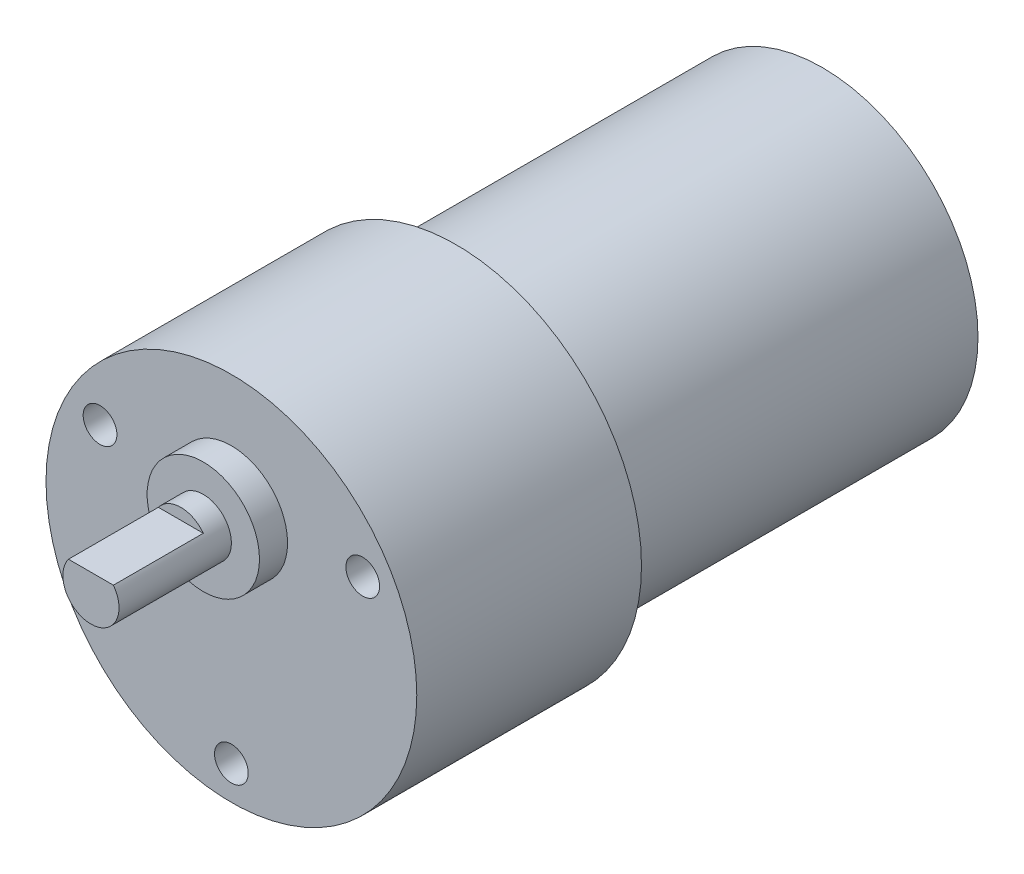
ISO-10303-21;
HEADER;
FILE_DESCRIPTION(('STEP AP214'),'2;1');
FILE_NAME('part.step','',(''),(''),'','','');
FILE_SCHEMA(('AUTOMOTIVE_DESIGN { 1 0 10303 214 1 1 1 1 }'));
ENDSEC;
DATA;
#1=APPLICATION_CONTEXT('core data for automotive mechanical design processes');
#2=APPLICATION_PROTOCOL_DEFINITION('international standard','automotive_design',2000,#1);
#3=PRODUCT_CONTEXT('',#1,'mechanical');
#4=PRODUCT('Part','Part','',(#3));
#5=PRODUCT_RELATED_PRODUCT_CATEGORY('part','',(#4));
#6=PRODUCT_DEFINITION_FORMATION('','',#4);
#7=PRODUCT_DEFINITION_CONTEXT('part definition',#1,'design');
#8=PRODUCT_DEFINITION('design','',#6,#7);
#9=PRODUCT_DEFINITION_SHAPE('','',#8);
#10=(LENGTH_UNIT() NAMED_UNIT(*) SI_UNIT(.MILLI.,.METRE.));
#11=(NAMED_UNIT(*) PLANE_ANGLE_UNIT() SI_UNIT($,.RADIAN.));
#12=(NAMED_UNIT(*) SI_UNIT($,.STERADIAN.) SOLID_ANGLE_UNIT());
#13=UNCERTAINTY_MEASURE_WITH_UNIT(LENGTH_MEASURE(1.E-05),#10,'distance_accuracy_value','');
#14=(GEOMETRIC_REPRESENTATION_CONTEXT(3) GLOBAL_UNCERTAINTY_ASSIGNED_CONTEXT((#13)) GLOBAL_UNIT_ASSIGNED_CONTEXT((#10,
#11,#12)) REPRESENTATION_CONTEXT('',''));
#15=CARTESIAN_POINT('',(0.,0.,0.));
#16=DIRECTION('',(0.,0.,1.));
#17=DIRECTION('',(1.,0.,0.));
#18=AXIS2_PLACEMENT_3D('',#15,#16,#17);
#19=CARTESIAN_POINT('',(0.,0.,0.));
#20=DIRECTION('',(0.,0.,1.));
#21=DIRECTION('',(1.,0.,0.));
#22=AXIS2_PLACEMENT_3D('',#19,#20,#21);
#23=PLANE('',#22);
#24=CARTESIAN_POINT('',(0.,-13.5,0.));
#25=DIRECTION('',(0.,0.,1.));
#26=DIRECTION('',(1.,0.,0.));
#27=AXIS2_PLACEMENT_3D('',#24,#25,#26);
#28=CIRCLE('',#27,1.50000004800011);
#29=CARTESIAN_POINT('',(1.50000004800011,-13.5,0.));
#30=VERTEX_POINT('',#29);
#31=EDGE_CURVE('E119',#30,#30,#28,.T.);
#32=ORIENTED_EDGE('',*,*,#31,.F.);
#33=EDGE_LOOP('',(#32));
#34=FACE_BOUND('',#33,.T.);
#35=CARTESIAN_POINT('',(-11.6913429510899,6.75000000000005,0.));
#36=DIRECTION('',(0.,0.,1.));
#37=DIRECTION('',(1.,0.,0.));
#38=AXIS2_PLACEMENT_3D('',#35,#36,#37);
#39=CIRCLE('',#38,1.50000004800011);
#40=CARTESIAN_POINT('',(-10.1913429030898,6.75000000000005,0.));
#41=VERTEX_POINT('',#40);
#42=EDGE_CURVE('E123',#41,#41,#39,.T.);
#43=ORIENTED_EDGE('',*,*,#42,.F.);
#44=EDGE_LOOP('',(#43));
#45=FACE_BOUND('',#44,.T.);
#46=CARTESIAN_POINT('',(11.69134295109,6.74999999999989,0.));
#47=DIRECTION('',(0.,0.,1.));
#48=DIRECTION('',(1.,0.,0.));
#49=AXIS2_PLACEMENT_3D('',#46,#47,#48);
#50=CIRCLE('',#49,1.5000000480001);
#51=CARTESIAN_POINT('',(13.1913429990901,6.74999999999989,0.));
#52=VERTEX_POINT('',#51);
#53=EDGE_CURVE('E127',#52,#52,#50,.T.);
#54=ORIENTED_EDGE('',*,*,#53,.F.);
#55=EDGE_LOOP('',(#54));
#56=FACE_BOUND('',#55,.T.);
#57=CARTESIAN_POINT('',(0.,6.,0.));
#58=DIRECTION('',(0.,0.,1.));
#59=DIRECTION('',(1.,0.,0.));
#60=AXIS2_PLACEMENT_3D('',#57,#58,#59);
#61=CIRCLE('',#60,5.);
#62=CARTESIAN_POINT('',(5.,6.,0.));
#63=VERTEX_POINT('',#62);
#64=EDGE_CURVE('E74',#63,#63,#61,.T.);
#65=ORIENTED_EDGE('',*,*,#64,.F.);
#66=EDGE_LOOP('',(#65));
#67=FACE_BOUND('',#66,.T.);
#68=CARTESIAN_POINT('',(0.,0.,0.));
#69=DIRECTION('',(0.,0.,-1.));
#70=DIRECTION('',(-1.,0.,0.));
#71=AXIS2_PLACEMENT_3D('',#68,#69,#70);
#72=CIRCLE('',#71,16.5);
#73=CARTESIAN_POINT('',(-16.5,0.,0.));
#74=VERTEX_POINT('',#73);
#75=EDGE_CURVE('E36',#74,#74,#72,.T.);
#76=ORIENTED_EDGE('',*,*,#75,.F.);
#77=EDGE_LOOP('',(#76));
#78=FACE_BOUND('',#77,.T.);
#79=ADVANCED_FACE('F33',(#34,#45,#56,#67,#78),#23,.T.);
#80=CARTESIAN_POINT('',(0.,0.,0.));
#81=DIRECTION('',(0.,0.,-1.));
#82=DIRECTION('',(-1.,0.,0.));
#83=AXIS2_PLACEMENT_3D('',#80,#81,#82);
#84=CYLINDRICAL_SURFACE('',#83,16.5);
#85=ORIENTED_EDGE('',*,*,#75,.T.);
#86=EDGE_LOOP('',(#85));
#87=FACE_BOUND('',#86,.T.);
#88=CARTESIAN_POINT('',(0.,0.,-20.));
#89=DIRECTION('',(0.,0.,-1.));
#90=DIRECTION('',(-1.,0.,0.));
#91=AXIS2_PLACEMENT_3D('',#88,#89,#90);
#92=CIRCLE('',#91,16.5);
#93=CARTESIAN_POINT('',(-16.5,0.,-20.));
#94=VERTEX_POINT('',#93);
#95=EDGE_CURVE('E100',#94,#94,#92,.T.);
#96=ORIENTED_EDGE('',*,*,#95,.F.);
#97=EDGE_LOOP('',(#96));
#98=FACE_BOUND('',#97,.T.);
#99=ADVANCED_FACE('F107',(#87,#98),#84,.T.);
#100=CARTESIAN_POINT('',(0.,16.5,-20.));
#101=DIRECTION('',(0.,0.,-1.));
#102=DIRECTION('',(-1.,0.,0.));
#103=AXIS2_PLACEMENT_3D('',#100,#101,#102);
#104=PLANE('',#103);
#105=ORIENTED_EDGE('',*,*,#95,.T.);
#106=EDGE_LOOP('',(#105));
#107=FACE_BOUND('',#106,.T.);
#108=CARTESIAN_POINT('',(0.,0.,-20.));
#109=DIRECTION('',(0.,0.,-1.));
#110=DIRECTION('',(-1.,0.,0.));
#111=AXIS2_PLACEMENT_3D('',#108,#109,#110);
#112=CIRCLE('',#111,13.85);
#113=CARTESIAN_POINT('',(-13.85,0.,-20.));
#114=VERTEX_POINT('',#113);
#115=EDGE_CURVE('E98',#114,#114,#112,.T.);
#116=ORIENTED_EDGE('',*,*,#115,.F.);
#117=EDGE_LOOP('',(#116));
#118=FACE_BOUND('',#117,.T.);
#119=ADVANCED_FACE('F115',(#107,#118),#104,.T.);
#120=CARTESIAN_POINT('',(0.,0.,0.));
#121=DIRECTION('',(0.,0.,-1.));
#122=DIRECTION('',(-1.,0.,0.));
#123=AXIS2_PLACEMENT_3D('',#120,#121,#122);
#124=CYLINDRICAL_SURFACE('',#123,13.85);
#125=ORIENTED_EDGE('',*,*,#115,.T.);
#126=EDGE_LOOP('',(#125));
#127=FACE_BOUND('',#126,.T.);
#128=CARTESIAN_POINT('',(0.,0.,-52.6));
#129=DIRECTION('',(0.,0.,-1.));
#130=DIRECTION('',(-1.,0.,0.));
#131=AXIS2_PLACEMENT_3D('',#128,#129,#130);
#132=CIRCLE('',#131,13.85);
#133=CARTESIAN_POINT('',(-13.85,0.,-52.6));
#134=VERTEX_POINT('',#133);
#135=EDGE_CURVE('E95',#134,#134,#132,.T.);
#136=ORIENTED_EDGE('',*,*,#135,.F.);
#137=EDGE_LOOP('',(#136));
#138=FACE_BOUND('',#137,.T.);
#139=ADVANCED_FACE('F162',(#127,#138),#124,.T.);
#140=CARTESIAN_POINT('',(0.,13.85,-52.6));
#141=DIRECTION('',(0.,0.,-1.));
#142=DIRECTION('',(-1.,0.,0.));
#143=AXIS2_PLACEMENT_3D('',#140,#141,#142);
#144=PLANE('',#143);
#145=ORIENTED_EDGE('',*,*,#135,.T.);
#146=EDGE_LOOP('',(#145));
#147=FACE_BOUND('',#146,.T.);
#148=CARTESIAN_POINT('',(0.,0.,-52.6));
#149=DIRECTION('',(0.,0.,-1.));
#150=DIRECTION('',(-1.,0.,0.));
#151=AXIS2_PLACEMENT_3D('',#148,#149,#150);
#152=CIRCLE('',#151,5.00000000000001);
#153=CARTESIAN_POINT('',(-5.00000000000001,0.,-52.6));
#154=VERTEX_POINT('',#153);
#155=EDGE_CURVE('E92',#154,#154,#152,.T.);
#156=ORIENTED_EDGE('',*,*,#155,.F.);
#157=EDGE_LOOP('',(#156));
#158=FACE_BOUND('',#157,.T.);
#159=ADVANCED_FACE('F158',(#147,#158),#144,.T.);
#160=CARTESIAN_POINT('',(0.,0.,0.));
#161=DIRECTION('',(0.,0.,-1.));
#162=DIRECTION('',(-1.,0.,0.));
#163=AXIS2_PLACEMENT_3D('',#160,#161,#162);
#164=CYLINDRICAL_SURFACE('',#163,5.00000000000001);
#165=ORIENTED_EDGE('',*,*,#155,.T.);
#166=EDGE_LOOP('',(#165));
#167=FACE_BOUND('',#166,.T.);
#168=CARTESIAN_POINT('',(0.,0.,-54.8));
#169=DIRECTION('',(0.,0.,-1.));
#170=DIRECTION('',(-1.,0.,0.));
#171=AXIS2_PLACEMENT_3D('',#168,#169,#170);
#172=CIRCLE('',#171,5.00000000000001);
#173=CARTESIAN_POINT('',(-5.00000000000001,0.,-54.8));
#174=VERTEX_POINT('',#173);
#175=EDGE_CURVE('E89',#174,#174,#172,.T.);
#176=ORIENTED_EDGE('',*,*,#175,.F.);
#177=EDGE_LOOP('',(#176));
#178=FACE_BOUND('',#177,.T.);
#179=ADVANCED_FACE('F154',(#167,#178),#164,.T.);
#180=CARTESIAN_POINT('',(0.,5.00000000000001,-54.8));
#181=DIRECTION('',(0.,0.,-1.));
#182=DIRECTION('',(-1.,0.,0.));
#183=AXIS2_PLACEMENT_3D('',#180,#181,#182);
#184=PLANE('',#183);
#185=ORIENTED_EDGE('',*,*,#175,.T.);
#186=EDGE_LOOP('',(#185));
#187=FACE_BOUND('',#186,.T.);
#188=CARTESIAN_POINT('',(0.,0.,-54.8));
#189=DIRECTION('',(0.,0.,-1.));
#190=DIRECTION('',(-1.,0.,0.));
#191=AXIS2_PLACEMENT_3D('',#188,#189,#190);
#192=CIRCLE('',#191,1.15000000000001);
#193=CARTESIAN_POINT('',(-1.15000000000001,0.,-54.8));
#194=VERTEX_POINT('',#193);
#195=EDGE_CURVE('E86',#194,#194,#192,.T.);
#196=ORIENTED_EDGE('',*,*,#195,.F.);
#197=EDGE_LOOP('',(#196));
#198=FACE_BOUND('',#197,.T.);
#199=ADVANCED_FACE('F150',(#187,#198),#184,.T.);
#200=CARTESIAN_POINT('',(0.,0.,0.));
#201=DIRECTION('',(0.,0.,-1.));
#202=DIRECTION('',(-1.,0.,0.));
#203=AXIS2_PLACEMENT_3D('',#200,#201,#202);
#204=CYLINDRICAL_SURFACE('',#203,1.15000000000001);
#205=ORIENTED_EDGE('',*,*,#195,.T.);
#206=EDGE_LOOP('',(#205));
#207=FACE_BOUND('',#206,.T.);
#208=CARTESIAN_POINT('',(0.,0.,-58.1));
#209=DIRECTION('',(0.,0.,-1.));
#210=DIRECTION('',(-1.,0.,0.));
#211=AXIS2_PLACEMENT_3D('',#208,#209,#210);
#212=CIRCLE('',#211,1.15000000000001);
#213=CARTESIAN_POINT('',(-1.15000000000001,0.,-58.1));
#214=VERTEX_POINT('',#213);
#215=EDGE_CURVE('E82',#214,#214,#212,.T.);
#216=ORIENTED_EDGE('',*,*,#215,.F.);
#217=EDGE_LOOP('',(#216));
#218=FACE_BOUND('',#217,.T.);
#219=ADVANCED_FACE('F142',(#207,#218),#204,.T.);
#220=CARTESIAN_POINT('',(0.,1.15000000000001,-58.1));
#221=DIRECTION('',(0.,0.,-1.));
#222=DIRECTION('',(-1.,0.,0.));
#223=AXIS2_PLACEMENT_3D('',#220,#221,#222);
#224=PLANE('',#223);
#225=ORIENTED_EDGE('',*,*,#215,.T.);
#226=EDGE_LOOP('',(#225));
#227=FACE_BOUND('',#226,.T.);
#228=ADVANCED_FACE('F133',(#227),#224,.T.);
#229=CARTESIAN_POINT('',(0.,6.,2.5));
#230=DIRECTION('',(0.,0.,-1.));
#231=DIRECTION('',(-1.,0.,0.));
#232=AXIS2_PLACEMENT_3D('',#229,#230,#231);
#233=CYLINDRICAL_SURFACE('',#232,5.);
#234=CARTESIAN_POINT('',(0.,6.,2.5));
#235=DIRECTION('',(0.,0.,1.));
#236=DIRECTION('',(1.,0.,0.));
#237=AXIS2_PLACEMENT_3D('',#234,#235,#236);
#238=CIRCLE('',#237,5.);
#239=CARTESIAN_POINT('',(5.,6.,2.5));
#240=VERTEX_POINT('',#239);
#241=EDGE_CURVE('E77',#240,#240,#238,.T.);
#242=ORIENTED_EDGE('',*,*,#241,.F.);
#243=EDGE_LOOP('',(#242));
#244=FACE_BOUND('',#243,.T.);
#245=ORIENTED_EDGE('',*,*,#64,.T.);
#246=EDGE_LOOP('',(#245));
#247=FACE_BOUND('',#246,.T.);
#248=ADVANCED_FACE('F130',(#244,#247),#233,.T.);
#249=CARTESIAN_POINT('',(0.,6.,2.5));
#250=DIRECTION('',(0.,0.,1.));
#251=DIRECTION('',(1.,0.,0.));
#252=AXIS2_PLACEMENT_3D('',#249,#250,#251);
#253=PLANE('',#252);
#254=CARTESIAN_POINT('',(0.,6.,2.5));
#255=DIRECTION('',(0.,0.,1.));
#256=DIRECTION('',(1.,0.,0.));
#257=AXIS2_PLACEMENT_3D('',#254,#255,#256);
#258=CIRCLE('',#257,2.5);
#259=CARTESIAN_POINT('',(2.5,6.,2.5));
#260=VERTEX_POINT('',#259);
#261=EDGE_CURVE('E11',#260,#260,#258,.T.);
#262=ORIENTED_EDGE('',*,*,#261,.F.);
#263=EDGE_LOOP('',(#262));
#264=FACE_BOUND('',#263,.T.);
#265=ORIENTED_EDGE('',*,*,#241,.T.);
#266=EDGE_LOOP('',(#265));
#267=FACE_BOUND('',#266,.T.);
#268=ADVANCED_FACE('F132',(#264,#267),#253,.T.);
#269=CARTESIAN_POINT('',(0.,6.,12.5));
#270=DIRECTION('',(0.,0.,-1.));
#271=DIRECTION('',(-1.,0.,0.));
#272=AXIS2_PLACEMENT_3D('',#269,#270,#271);
#273=CYLINDRICAL_SURFACE('',#272,2.5);
#274=CARTESIAN_POINT('',(0.,6.,12.5));
#275=DIRECTION('',(0.,0.,1.));
#276=DIRECTION('',(1.,0.,0.));
#277=AXIS2_PLACEMENT_3D('',#274,#275,#276);
#278=CIRCLE('',#277,2.5);
#279=CARTESIAN_POINT('',(-1.999999964,7.500000048,12.5));
#280=VERTEX_POINT('',#279);
#281=CARTESIAN_POINT('',(1.999999964,7.500000048,12.5));
#282=VERTEX_POINT('',#281);
#283=EDGE_CURVE('E71',#280,#282,#278,.T.);
#284=ORIENTED_EDGE('',*,*,#283,.F.);
#285=DIRECTION('',(0.,0.,1.));
#286=VECTOR('',#285,1.);
#287=CARTESIAN_POINT('',(-1.999999964,7.500000048,4.5));
#288=LINE('',#287,#286);
#289=CARTESIAN_POINT('',(-1.999999964,7.500000048,4.5));
#290=VERTEX_POINT('',#289);
#291=EDGE_CURVE('E48',#290,#280,#288,.T.);
#292=ORIENTED_EDGE('',*,*,#291,.F.);
#293=CARTESIAN_POINT('',(0.,6.,4.5));
#294=DIRECTION('',(0.,0.,1.));
#295=DIRECTION('',(-1.,0.,0.));
#296=AXIS2_PLACEMENT_3D('',#293,#294,#295);
#297=CIRCLE('',#296,2.5);
#298=CARTESIAN_POINT('',(1.999999964,7.500000048,4.5));
#299=VERTEX_POINT('',#298);
#300=EDGE_CURVE('E64',#299,#290,#297,.T.);
#301=ORIENTED_EDGE('',*,*,#300,.F.);
#302=DIRECTION('',(0.,0.,1.));
#303=VECTOR('',#302,1.);
#304=CARTESIAN_POINT('',(1.999999964,7.500000048,4.5));
#305=LINE('',#304,#303);
#306=EDGE_CURVE('E54',#299,#282,#305,.T.);
#307=ORIENTED_EDGE('',*,*,#306,.T.);
#308=EDGE_LOOP('',(#284,#292,#301,#307));
#309=FACE_BOUND('',#308,.T.);
#310=ORIENTED_EDGE('',*,*,#261,.T.);
#311=EDGE_LOOP('',(#310));
#312=FACE_BOUND('',#311,.T.);
#313=ADVANCED_FACE('F69',(#309,#312),#273,.T.);
#314=CARTESIAN_POINT('',(0.,6.,12.5));
#315=DIRECTION('',(0.,0.,1.));
#316=DIRECTION('',(1.,0.,0.));
#317=AXIS2_PLACEMENT_3D('',#314,#315,#316);
#318=PLANE('',#317);
#319=DIRECTION('',(1.,0.,0.));
#320=VECTOR('',#319,1.);
#321=CARTESIAN_POINT('',(-1.999999964,7.500000048,12.5));
#322=LINE('',#321,#320);
#323=EDGE_CURVE('E59',#280,#282,#322,.T.);
#324=ORIENTED_EDGE('',*,*,#323,.F.);
#325=ORIENTED_EDGE('',*,*,#283,.T.);
#326=EDGE_LOOP('',(#324,#325));
#327=FACE_BOUND('',#326,.T.);
#328=ADVANCED_FACE('F73',(#327),#318,.T.);
#329=CARTESIAN_POINT('',(-1.999999964,7.500000048,4.5));
#330=DIRECTION('',(0.,-1.,0.));
#331=DIRECTION('',(0.,0.,-1.));
#332=AXIS2_PLACEMENT_3D('',#329,#330,#331);
#333=PLANE('',#332);
#334=ORIENTED_EDGE('',*,*,#323,.T.);
#335=ORIENTED_EDGE('',*,*,#306,.F.);
#336=DIRECTION('',(1.,0.,0.));
#337=VECTOR('',#336,1.);
#338=CARTESIAN_POINT('',(-1.999999964,7.500000048,4.5));
#339=LINE('',#338,#337);
#340=EDGE_CURVE('E334',#290,#299,#339,.T.);
#341=ORIENTED_EDGE('',*,*,#340,.F.);
#342=ORIENTED_EDGE('',*,*,#291,.T.);
#343=EDGE_LOOP('',(#334,#335,#341,#342));
#344=FACE_BOUND('',#343,.T.);
#345=ADVANCED_FACE('F60',(#344),#333,.F.);
#346=CARTESIAN_POINT('',(0.,6.,4.5));
#347=DIRECTION('',(0.,0.,-1.));
#348=DIRECTION('',(-1.,0.,0.));
#349=AXIS2_PLACEMENT_3D('',#346,#347,#348);
#350=PLANE('',#349);
#351=ORIENTED_EDGE('',*,*,#300,.T.);
#352=ORIENTED_EDGE('',*,*,#340,.T.);
#353=EDGE_LOOP('',(#351,#352));
#354=FACE_BOUND('',#353,.T.);
#355=ADVANCED_FACE('F242',(#354),#350,.F.);
#356=CARTESIAN_POINT('',(11.69134295109,6.74999999999989,-5.));
#357=DIRECTION('',(0.,0.,1.));
#358=DIRECTION('',(1.,0.,0.));
#359=AXIS2_PLACEMENT_3D('',#356,#357,#358);
#360=CYLINDRICAL_SURFACE('',#359,1.5000000480001);
#361=CARTESIAN_POINT('',(11.69134295109,6.74999999999989,-5.));
#362=DIRECTION('',(0.,0.,1.));
#363=DIRECTION('',(1.,0.,0.));
#364=AXIS2_PLACEMENT_3D('',#361,#362,#363);
#365=CIRCLE('',#364,1.5000000480001);
#366=CARTESIAN_POINT('',(13.1913429990901,6.74999999999989,-5.));
#367=VERTEX_POINT('',#366);
#368=EDGE_CURVE('E329',#367,#367,#365,.T.);
#369=ORIENTED_EDGE('',*,*,#368,.F.);
#370=EDGE_LOOP('',(#369));
#371=FACE_BOUND('',#370,.T.);
#372=ORIENTED_EDGE('',*,*,#53,.T.);
#373=EDGE_LOOP('',(#372));
#374=FACE_BOUND('',#373,.T.);
#375=ADVANCED_FACE('F250',(#371,#374),#360,.F.);
#376=CARTESIAN_POINT('',(11.69134295109,6.74999999999989,-5.));
#377=DIRECTION('',(0.,0.,1.));
#378=DIRECTION('',(1.,0.,0.));
#379=AXIS2_PLACEMENT_3D('',#376,#377,#378);
#380=PLANE('',#379);
#381=ORIENTED_EDGE('',*,*,#368,.T.);
#382=EDGE_LOOP('',(#381));
#383=FACE_BOUND('',#382,.T.);
#384=ADVANCED_FACE('F266',(#383),#380,.T.);
#385=CARTESIAN_POINT('',(-11.6913429510899,6.75000000000005,-5.));
#386=DIRECTION('',(0.,0.,1.));
#387=DIRECTION('',(1.,0.,0.));
#388=AXIS2_PLACEMENT_3D('',#385,#386,#387);
#389=CYLINDRICAL_SURFACE('',#388,1.50000004800011);
#390=CARTESIAN_POINT('',(-11.6913429510899,6.75000000000005,-5.));
#391=DIRECTION('',(0.,0.,1.));
#392=DIRECTION('',(1.,0.,0.));
#393=AXIS2_PLACEMENT_3D('',#390,#391,#392);
#394=CIRCLE('',#393,1.50000004800011);
#395=CARTESIAN_POINT('',(-10.1913429030898,6.75000000000005,-5.));
#396=VERTEX_POINT('',#395);
#397=EDGE_CURVE('E323',#396,#396,#394,.T.);
#398=ORIENTED_EDGE('',*,*,#397,.F.);
#399=EDGE_LOOP('',(#398));
#400=FACE_BOUND('',#399,.T.);
#401=ORIENTED_EDGE('',*,*,#42,.T.);
#402=EDGE_LOOP('',(#401));
#403=FACE_BOUND('',#402,.T.);
#404=ADVANCED_FACE('F276',(#400,#403),#389,.F.);
#405=CARTESIAN_POINT('',(-11.6913429510899,6.75000000000005,-5.));
#406=DIRECTION('',(0.,0.,1.));
#407=DIRECTION('',(1.,0.,0.));
#408=AXIS2_PLACEMENT_3D('',#405,#406,#407);
#409=PLANE('',#408);
#410=ORIENTED_EDGE('',*,*,#397,.T.);
#411=EDGE_LOOP('',(#410));
#412=FACE_BOUND('',#411,.T.);
#413=ADVANCED_FACE('F286',(#412),#409,.T.);
#414=CARTESIAN_POINT('',(0.,-13.5,-5.));
#415=DIRECTION('',(0.,0.,1.));
#416=DIRECTION('',(1.,0.,0.));
#417=AXIS2_PLACEMENT_3D('',#414,#415,#416);
#418=CYLINDRICAL_SURFACE('',#417,1.50000004800011);
#419=CARTESIAN_POINT('',(0.,-13.5,-5.));
#420=DIRECTION('',(0.,0.,1.));
#421=DIRECTION('',(1.,0.,0.));
#422=AXIS2_PLACEMENT_3D('',#419,#420,#421);
#423=CIRCLE('',#422,1.50000004800011);
#424=CARTESIAN_POINT('',(1.50000004800011,-13.5,-5.));
#425=VERTEX_POINT('',#424);
#426=EDGE_CURVE('E65',#425,#425,#423,.T.);
#427=ORIENTED_EDGE('',*,*,#426,.F.);
#428=EDGE_LOOP('',(#427));
#429=FACE_BOUND('',#428,.T.);
#430=ORIENTED_EDGE('',*,*,#31,.T.);
#431=EDGE_LOOP('',(#430));
#432=FACE_BOUND('',#431,.T.);
#433=ADVANCED_FACE('F296',(#429,#432),#418,.F.);
#434=CARTESIAN_POINT('',(0.,-13.5,-5.));
#435=DIRECTION('',(0.,0.,1.));
#436=DIRECTION('',(1.,0.,0.));
#437=AXIS2_PLACEMENT_3D('',#434,#435,#436);
#438=PLANE('',#437);
#439=ORIENTED_EDGE('',*,*,#426,.T.);
#440=EDGE_LOOP('',(#439));
#441=FACE_BOUND('',#440,.T.);
#442=ADVANCED_FACE('F306',(#441),#438,.T.);
#443=CLOSED_SHELL('',(#79,#99,#119,#139,#159,#179,#199,#219,#228,#248,#268,#313,#328,#345,#355,
#375,#384,#404,#413,#433,#442));
#444=MANIFOLD_SOLID_BREP('B2',#443);
#445=ADVANCED_BREP_SHAPE_REPRESENTATION('',(#18,#444),#14);
#446=SHAPE_DEFINITION_REPRESENTATION(#9,#445);
ENDSEC;
END-ISO-10303-21;
